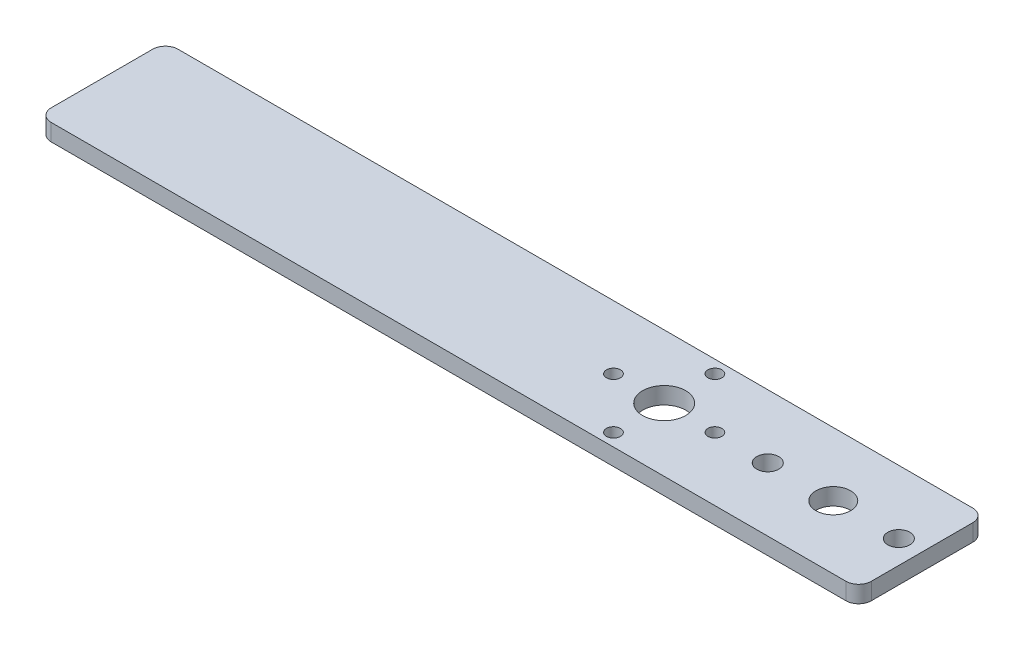
ISO-10303-21;
HEADER;
FILE_DESCRIPTION(('STEP AP214'),'2;1');
FILE_NAME('part.step','',(''),(''),'','','');
FILE_SCHEMA(('AUTOMOTIVE_DESIGN { 1 0 10303 214 1 1 1 1 }'));
ENDSEC;
DATA;
#1=APPLICATION_CONTEXT('core data for automotive mechanical design processes');
#2=APPLICATION_PROTOCOL_DEFINITION('international standard','automotive_design',2000,#1);
#3=PRODUCT_CONTEXT('',#1,'mechanical');
#4=PRODUCT('Part','Part','',(#3));
#5=PRODUCT_RELATED_PRODUCT_CATEGORY('part','',(#4));
#6=PRODUCT_DEFINITION_FORMATION('','',#4);
#7=PRODUCT_DEFINITION_CONTEXT('part definition',#1,'design');
#8=PRODUCT_DEFINITION('design','',#6,#7);
#9=PRODUCT_DEFINITION_SHAPE('','',#8);
#10=(LENGTH_UNIT() NAMED_UNIT(*) SI_UNIT(.MILLI.,.METRE.));
#11=(NAMED_UNIT(*) PLANE_ANGLE_UNIT() SI_UNIT($,.RADIAN.));
#12=(NAMED_UNIT(*) SI_UNIT($,.STERADIAN.) SOLID_ANGLE_UNIT());
#13=UNCERTAINTY_MEASURE_WITH_UNIT(LENGTH_MEASURE(1.E-05),#10,'distance_accuracy_value','');
#14=(GEOMETRIC_REPRESENTATION_CONTEXT(3) GLOBAL_UNCERTAINTY_ASSIGNED_CONTEXT((#13)) GLOBAL_UNIT_ASSIGNED_CONTEXT((#10,
#11,#12)) REPRESENTATION_CONTEXT('',''));
#15=CARTESIAN_POINT('',(0.,0.,0.));
#16=DIRECTION('',(0.,0.,1.));
#17=DIRECTION('',(1.,0.,0.));
#18=AXIS2_PLACEMENT_3D('',#15,#16,#17);
#19=CARTESIAN_POINT('',(146.,4.,12.));
#20=DIRECTION('',(0.,-1.,0.));
#21=DIRECTION('',(0.,0.,-1.));
#22=AXIS2_PLACEMENT_3D('',#19,#20,#21);
#23=PLANE('',#22);
#24=CARTESIAN_POINT('',(146.,4.,12.));
#25=DIRECTION('',(0.,1.,0.));
#26=DIRECTION('',(0.,0.,-1.));
#27=AXIS2_PLACEMENT_3D('',#24,#25,#26);
#28=CIRCLE('',#27,3.00000000000001);
#29=CARTESIAN_POINT('',(146.,4.,15.));
#30=VERTEX_POINT('',#29);
#31=CARTESIAN_POINT('',(149.,4.,12.));
#32=VERTEX_POINT('',#31);
#33=EDGE_CURVE('E148',#30,#32,#28,.T.);
#34=ORIENTED_EDGE('',*,*,#33,.T.);
#35=DIRECTION('',(0.,0.,-1.));
#36=VECTOR('',#35,1.);
#37=CARTESIAN_POINT('',(149.,4.,-12.));
#38=LINE('',#37,#36);
#39=CARTESIAN_POINT('',(149.,4.,-12.));
#40=VERTEX_POINT('',#39);
#41=EDGE_CURVE('E96',#32,#40,#38,.T.);
#42=ORIENTED_EDGE('',*,*,#41,.T.);
#43=CARTESIAN_POINT('',(146.,4.,-12.));
#44=DIRECTION('',(0.,1.,0.));
#45=DIRECTION('',(0.,0.,1.));
#46=AXIS2_PLACEMENT_3D('',#43,#44,#45);
#47=CIRCLE('',#46,3.00000000000001);
#48=CARTESIAN_POINT('',(146.,4.,-15.));
#49=VERTEX_POINT('',#48);
#50=EDGE_CURVE('E163',#40,#49,#47,.T.);
#51=ORIENTED_EDGE('',*,*,#50,.T.);
#52=DIRECTION('',(-1.,0.,0.));
#53=VECTOR('',#52,1.);
#54=CARTESIAN_POINT('',(-42.,4.,-15.));
#55=LINE('',#54,#53);
#56=CARTESIAN_POINT('',(-42.,4.,-15.));
#57=VERTEX_POINT('',#56);
#58=EDGE_CURVE('E176',#49,#57,#55,.T.);
#59=ORIENTED_EDGE('',*,*,#58,.T.);
#60=CARTESIAN_POINT('',(-42.,4.,-12.));
#61=DIRECTION('',(0.,1.,0.));
#62=DIRECTION('',(0.,0.,-1.));
#63=AXIS2_PLACEMENT_3D('',#60,#61,#62);
#64=CIRCLE('',#63,3.00000000000001);
#65=CARTESIAN_POINT('',(-45.,4.,-12.));
#66=VERTEX_POINT('',#65);
#67=EDGE_CURVE('E115',#57,#66,#64,.T.);
#68=ORIENTED_EDGE('',*,*,#67,.T.);
#69=DIRECTION('',(0.,0.,1.));
#70=VECTOR('',#69,1.);
#71=CARTESIAN_POINT('',(-45.,4.,-12.));
#72=LINE('',#71,#70);
#73=CARTESIAN_POINT('',(-45.,4.,12.));
#74=VERTEX_POINT('',#73);
#75=EDGE_CURVE('E109',#66,#74,#72,.T.);
#76=ORIENTED_EDGE('',*,*,#75,.T.);
#77=CARTESIAN_POINT('',(-42.,4.,12.));
#78=DIRECTION('',(0.,1.,0.));
#79=DIRECTION('',(0.,0.,-1.));
#80=AXIS2_PLACEMENT_3D('',#77,#78,#79);
#81=CIRCLE('',#80,3.);
#82=CARTESIAN_POINT('',(-42.,4.,15.));
#83=VERTEX_POINT('',#82);
#84=EDGE_CURVE('E113',#74,#83,#81,.T.);
#85=ORIENTED_EDGE('',*,*,#84,.T.);
#86=DIRECTION('',(1.,0.,0.));
#87=VECTOR('',#86,1.);
#88=CARTESIAN_POINT('',(-42.,4.,15.));
#89=LINE('',#88,#87);
#90=EDGE_CURVE('E53',#83,#30,#89,.T.);
#91=ORIENTED_EDGE('',*,*,#90,.T.);
#92=EDGE_LOOP('',(#34,#42,#51,#59,#68,#76,#85,#91));
#93=FACE_BOUND('',#92,.T.);
#94=CARTESIAN_POINT('',(88.,4.,0.));
#95=DIRECTION('',(0.,1.,0.));
#96=DIRECTION('',(0.,0.,1.));
#97=AXIS2_PLACEMENT_3D('',#94,#95,#96);
#98=CIRCLE('',#97,5.10000000000001);
#99=CARTESIAN_POINT('',(88.,4.,5.10000000000002));
#100=VERTEX_POINT('',#99);
#101=EDGE_CURVE('E137',#100,#100,#98,.T.);
#102=ORIENTED_EDGE('',*,*,#101,.F.);
#103=EDGE_LOOP('',(#102));
#104=FACE_BOUND('',#103,.T.);
#105=CARTESIAN_POINT('',(88.,4.,-12.));
#106=DIRECTION('',(0.,1.,0.));
#107=DIRECTION('',(0.,0.,1.));
#108=AXIS2_PLACEMENT_3D('',#105,#106,#107);
#109=CIRCLE('',#108,1.65);
#110=CARTESIAN_POINT('',(88.,4.,-10.35));
#111=VERTEX_POINT('',#110);
#112=EDGE_CURVE('E185',#111,#111,#109,.T.);
#113=ORIENTED_EDGE('',*,*,#112,.F.);
#114=EDGE_LOOP('',(#113));
#115=FACE_BOUND('',#114,.T.);
#116=CARTESIAN_POINT('',(88.,4.,12.));
#117=DIRECTION('',(0.,1.,0.));
#118=DIRECTION('',(0.,0.,1.));
#119=AXIS2_PLACEMENT_3D('',#116,#117,#118);
#120=CIRCLE('',#119,1.65);
#121=CARTESIAN_POINT('',(88.,4.,13.65));
#122=VERTEX_POINT('',#121);
#123=EDGE_CURVE('E191',#122,#122,#120,.T.);
#124=ORIENTED_EDGE('',*,*,#123,.F.);
#125=EDGE_LOOP('',(#124));
#126=FACE_BOUND('',#125,.T.);
#127=CARTESIAN_POINT('',(100.,4.,0.));
#128=DIRECTION('',(0.,1.,0.));
#129=DIRECTION('',(0.,0.,-1.));
#130=AXIS2_PLACEMENT_3D('',#127,#128,#129);
#131=CIRCLE('',#130,1.65);
#132=CARTESIAN_POINT('',(100.,4.,-1.64999999999999));
#133=VERTEX_POINT('',#132);
#134=EDGE_CURVE('E197',#133,#133,#131,.T.);
#135=ORIENTED_EDGE('',*,*,#134,.F.);
#136=EDGE_LOOP('',(#135));
#137=FACE_BOUND('',#136,.T.);
#138=CARTESIAN_POINT('',(76.,4.,0.));
#139=DIRECTION('',(0.,1.,0.));
#140=DIRECTION('',(0.,0.,1.));
#141=AXIS2_PLACEMENT_3D('',#138,#139,#140);
#142=CIRCLE('',#141,1.65);
#143=CARTESIAN_POINT('',(76.,4.,1.65000000000002));
#144=VERTEX_POINT('',#143);
#145=EDGE_CURVE('E203',#144,#144,#142,.T.);
#146=ORIENTED_EDGE('',*,*,#145,.F.);
#147=EDGE_LOOP('',(#146));
#148=FACE_BOUND('',#147,.T.);
#149=CARTESIAN_POINT('',(143.5,4.,0.));
#150=DIRECTION('',(0.,1.,0.));
#151=DIRECTION('',(0.,0.,1.));
#152=AXIS2_PLACEMENT_3D('',#149,#150,#151);
#153=CIRCLE('',#152,2.59999999999999);
#154=CARTESIAN_POINT('',(143.5,4.,2.59999999999999));
#155=VERTEX_POINT('',#154);
#156=EDGE_CURVE('E209',#155,#155,#153,.T.);
#157=ORIENTED_EDGE('',*,*,#156,.F.);
#158=EDGE_LOOP('',(#157));
#159=FACE_BOUND('',#158,.T.);
#160=CARTESIAN_POINT('',(112.5,4.,0.));
#161=DIRECTION('',(0.,1.,0.));
#162=DIRECTION('',(0.,0.,1.));
#163=AXIS2_PLACEMENT_3D('',#160,#161,#162);
#164=CIRCLE('',#163,2.6);
#165=CARTESIAN_POINT('',(112.5,4.,2.6));
#166=VERTEX_POINT('',#165);
#167=EDGE_CURVE('E215',#166,#166,#164,.T.);
#168=ORIENTED_EDGE('',*,*,#167,.F.);
#169=EDGE_LOOP('',(#168));
#170=FACE_BOUND('',#169,.T.);
#171=CARTESIAN_POINT('',(128.,4.,0.));
#172=DIRECTION('',(0.,1.,0.));
#173=DIRECTION('',(0.,0.,1.));
#174=AXIS2_PLACEMENT_3D('',#171,#172,#173);
#175=CIRCLE('',#174,4.09999999999999);
#176=CARTESIAN_POINT('',(128.,4.,4.09999999999999));
#177=VERTEX_POINT('',#176);
#178=EDGE_CURVE('E221',#177,#177,#175,.T.);
#179=ORIENTED_EDGE('',*,*,#178,.F.);
#180=EDGE_LOOP('',(#179));
#181=FACE_BOUND('',#180,.T.);
#182=ADVANCED_FACE('F36',(#93,#104,#115,#126,#137,#148,#159,#170,#181),#23,.F.);
#183=CARTESIAN_POINT('',(146.,0.,12.));
#184=DIRECTION('',(0.,-1.,0.));
#185=DIRECTION('',(0.,0.,-1.));
#186=AXIS2_PLACEMENT_3D('',#183,#184,#185);
#187=PLANE('',#186);
#188=CARTESIAN_POINT('',(112.5,0.,0.));
#189=DIRECTION('',(0.,1.,0.));
#190=DIRECTION('',(0.,0.,1.));
#191=AXIS2_PLACEMENT_3D('',#188,#189,#190);
#192=CIRCLE('',#191,2.6);
#193=CARTESIAN_POINT('',(112.5,0.,2.6));
#194=VERTEX_POINT('',#193);
#195=EDGE_CURVE('E218',#194,#194,#192,.T.);
#196=ORIENTED_EDGE('',*,*,#195,.T.);
#197=EDGE_LOOP('',(#196));
#198=FACE_BOUND('',#197,.T.);
#199=CARTESIAN_POINT('',(76.,0.,0.));
#200=DIRECTION('',(0.,1.,0.));
#201=DIRECTION('',(0.,0.,1.));
#202=AXIS2_PLACEMENT_3D('',#199,#200,#201);
#203=CIRCLE('',#202,1.65);
#204=CARTESIAN_POINT('',(76.,0.,1.65000000000002));
#205=VERTEX_POINT('',#204);
#206=EDGE_CURVE('E206',#205,#205,#203,.T.);
#207=ORIENTED_EDGE('',*,*,#206,.T.);
#208=EDGE_LOOP('',(#207));
#209=FACE_BOUND('',#208,.T.);
#210=CARTESIAN_POINT('',(88.,0.,12.));
#211=DIRECTION('',(0.,1.,0.));
#212=DIRECTION('',(0.,0.,1.));
#213=AXIS2_PLACEMENT_3D('',#210,#211,#212);
#214=CIRCLE('',#213,1.65);
#215=CARTESIAN_POINT('',(88.,0.,13.65));
#216=VERTEX_POINT('',#215);
#217=EDGE_CURVE('E194',#216,#216,#214,.T.);
#218=ORIENTED_EDGE('',*,*,#217,.T.);
#219=EDGE_LOOP('',(#218));
#220=FACE_BOUND('',#219,.T.);
#221=CARTESIAN_POINT('',(88.,0.,0.));
#222=DIRECTION('',(0.,1.,0.));
#223=DIRECTION('',(0.,0.,1.));
#224=AXIS2_PLACEMENT_3D('',#221,#222,#223);
#225=CIRCLE('',#224,5.10000000000001);
#226=CARTESIAN_POINT('',(88.,0.,5.10000000000002));
#227=VERTEX_POINT('',#226);
#228=EDGE_CURVE('E182',#227,#227,#225,.T.);
#229=ORIENTED_EDGE('',*,*,#228,.T.);
#230=EDGE_LOOP('',(#229));
#231=FACE_BOUND('',#230,.T.);
#232=CARTESIAN_POINT('',(146.,0.,12.));
#233=DIRECTION('',(0.,1.,0.));
#234=DIRECTION('',(0.,0.,-1.));
#235=AXIS2_PLACEMENT_3D('',#232,#233,#234);
#236=CIRCLE('',#235,3.00000000000001);
#237=CARTESIAN_POINT('',(146.,0.,15.));
#238=VERTEX_POINT('',#237);
#239=CARTESIAN_POINT('',(149.,0.,12.));
#240=VERTEX_POINT('',#239);
#241=EDGE_CURVE('E133',#238,#240,#236,.T.);
#242=ORIENTED_EDGE('',*,*,#241,.F.);
#243=DIRECTION('',(1.,0.,0.));
#244=VECTOR('',#243,1.);
#245=CARTESIAN_POINT('',(-42.,0.,15.));
#246=LINE('',#245,#244);
#247=CARTESIAN_POINT('',(-42.,0.,15.));
#248=VERTEX_POINT('',#247);
#249=EDGE_CURVE('E88',#248,#238,#246,.T.);
#250=ORIENTED_EDGE('',*,*,#249,.F.);
#251=CARTESIAN_POINT('',(-42.,0.,12.));
#252=DIRECTION('',(0.,1.,0.));
#253=DIRECTION('',(0.,0.,-1.));
#254=AXIS2_PLACEMENT_3D('',#251,#252,#253);
#255=CIRCLE('',#254,3.);
#256=CARTESIAN_POINT('',(-45.,0.,12.));
#257=VERTEX_POINT('',#256);
#258=EDGE_CURVE('E82',#257,#248,#255,.T.);
#259=ORIENTED_EDGE('',*,*,#258,.F.);
#260=DIRECTION('',(0.,0.,1.));
#261=VECTOR('',#260,1.);
#262=CARTESIAN_POINT('',(-45.,0.,-12.));
#263=LINE('',#262,#261);
#264=CARTESIAN_POINT('',(-45.,0.,-12.));
#265=VERTEX_POINT('',#264);
#266=EDGE_CURVE('E123',#265,#257,#263,.T.);
#267=ORIENTED_EDGE('',*,*,#266,.F.);
#268=CARTESIAN_POINT('',(-42.,0.,-12.));
#269=DIRECTION('',(0.,1.,0.));
#270=DIRECTION('',(0.,0.,-1.));
#271=AXIS2_PLACEMENT_3D('',#268,#269,#270);
#272=CIRCLE('',#271,3.00000000000001);
#273=CARTESIAN_POINT('',(-42.,0.,-15.));
#274=VERTEX_POINT('',#273);
#275=EDGE_CURVE('E143',#274,#265,#272,.T.);
#276=ORIENTED_EDGE('',*,*,#275,.F.);
#277=DIRECTION('',(-1.,0.,0.));
#278=VECTOR('',#277,1.);
#279=CARTESIAN_POINT('',(-42.,0.,-15.));
#280=LINE('',#279,#278);
#281=CARTESIAN_POINT('',(146.,0.,-15.));
#282=VERTEX_POINT('',#281);
#283=EDGE_CURVE('E141',#282,#274,#280,.T.);
#284=ORIENTED_EDGE('',*,*,#283,.F.);
#285=CARTESIAN_POINT('',(146.,0.,-12.));
#286=DIRECTION('',(0.,1.,0.));
#287=DIRECTION('',(0.,0.,1.));
#288=AXIS2_PLACEMENT_3D('',#285,#286,#287);
#289=CIRCLE('',#288,3.00000000000001);
#290=CARTESIAN_POINT('',(149.,0.,-12.));
#291=VERTEX_POINT('',#290);
#292=EDGE_CURVE('E139',#291,#282,#289,.T.);
#293=ORIENTED_EDGE('',*,*,#292,.F.);
#294=DIRECTION('',(0.,0.,-1.));
#295=VECTOR('',#294,1.);
#296=CARTESIAN_POINT('',(149.,0.,-12.));
#297=LINE('',#296,#295);
#298=EDGE_CURVE('E136',#240,#291,#297,.T.);
#299=ORIENTED_EDGE('',*,*,#298,.F.);
#300=EDGE_LOOP('',(#242,#250,#259,#267,#276,#284,#293,#299));
#301=FACE_BOUND('',#300,.T.);
#302=CARTESIAN_POINT('',(88.,0.,-12.));
#303=DIRECTION('',(0.,1.,0.));
#304=DIRECTION('',(0.,0.,1.));
#305=AXIS2_PLACEMENT_3D('',#302,#303,#304);
#306=CIRCLE('',#305,1.65);
#307=CARTESIAN_POINT('',(88.,0.,-10.35));
#308=VERTEX_POINT('',#307);
#309=EDGE_CURVE('E188',#308,#308,#306,.T.);
#310=ORIENTED_EDGE('',*,*,#309,.T.);
#311=EDGE_LOOP('',(#310));
#312=FACE_BOUND('',#311,.T.);
#313=CARTESIAN_POINT('',(100.,0.,0.));
#314=DIRECTION('',(0.,1.,0.));
#315=DIRECTION('',(0.,0.,-1.));
#316=AXIS2_PLACEMENT_3D('',#313,#314,#315);
#317=CIRCLE('',#316,1.65);
#318=CARTESIAN_POINT('',(100.,0.,-1.64999999999999));
#319=VERTEX_POINT('',#318);
#320=EDGE_CURVE('E200',#319,#319,#317,.T.);
#321=ORIENTED_EDGE('',*,*,#320,.T.);
#322=EDGE_LOOP('',(#321));
#323=FACE_BOUND('',#322,.T.);
#324=CARTESIAN_POINT('',(143.5,0.,0.));
#325=DIRECTION('',(0.,1.,0.));
#326=DIRECTION('',(0.,0.,1.));
#327=AXIS2_PLACEMENT_3D('',#324,#325,#326);
#328=CIRCLE('',#327,2.59999999999999);
#329=CARTESIAN_POINT('',(143.5,0.,2.59999999999999));
#330=VERTEX_POINT('',#329);
#331=EDGE_CURVE('E212',#330,#330,#328,.T.);
#332=ORIENTED_EDGE('',*,*,#331,.T.);
#333=EDGE_LOOP('',(#332));
#334=FACE_BOUND('',#333,.T.);
#335=CARTESIAN_POINT('',(128.,0.,0.));
#336=DIRECTION('',(0.,1.,0.));
#337=DIRECTION('',(0.,0.,1.));
#338=AXIS2_PLACEMENT_3D('',#335,#336,#337);
#339=CIRCLE('',#338,4.09999999999999);
#340=CARTESIAN_POINT('',(128.,0.,4.09999999999999));
#341=VERTEX_POINT('',#340);
#342=EDGE_CURVE('E224',#341,#341,#339,.T.);
#343=ORIENTED_EDGE('',*,*,#342,.T.);
#344=EDGE_LOOP('',(#343));
#345=FACE_BOUND('',#344,.T.);
#346=ADVANCED_FACE('F167',(#198,#209,#220,#231,#301,#312,#323,#334,#345),#187,.T.);
#347=CARTESIAN_POINT('',(146.,4.,12.));
#348=DIRECTION('',(0.,-1.,0.));
#349=DIRECTION('',(0.,0.,-1.));
#350=AXIS2_PLACEMENT_3D('',#347,#348,#349);
#351=CYLINDRICAL_SURFACE('',#350,3.00000000000001);
#352=ORIENTED_EDGE('',*,*,#241,.T.);
#353=DIRECTION('',(0.,-1.,0.));
#354=VECTOR('',#353,1.);
#355=CARTESIAN_POINT('',(149.,4.,12.));
#356=LINE('',#355,#354);
#357=EDGE_CURVE('E11',#32,#240,#356,.T.);
#358=ORIENTED_EDGE('',*,*,#357,.F.);
#359=ORIENTED_EDGE('',*,*,#33,.F.);
#360=DIRECTION('',(0.,-1.,0.));
#361=VECTOR('',#360,1.);
#362=CARTESIAN_POINT('',(146.,4.,15.));
#363=LINE('',#362,#361);
#364=EDGE_CURVE('E129',#30,#238,#363,.T.);
#365=ORIENTED_EDGE('',*,*,#364,.T.);
#366=EDGE_LOOP('',(#352,#358,#359,#365));
#367=FACE_BOUND('',#366,.T.);
#368=ADVANCED_FACE('F38',(#367),#351,.T.);
#369=CARTESIAN_POINT('',(149.,4.,-12.));
#370=DIRECTION('',(-1.,0.,0.));
#371=DIRECTION('',(0.,0.,1.));
#372=AXIS2_PLACEMENT_3D('',#369,#370,#371);
#373=PLANE('',#372);
#374=ORIENTED_EDGE('',*,*,#298,.T.);
#375=DIRECTION('',(0.,-1.,0.));
#376=VECTOR('',#375,1.);
#377=CARTESIAN_POINT('',(149.,4.,-12.));
#378=LINE('',#377,#376);
#379=EDGE_CURVE('E45',#40,#291,#378,.T.);
#380=ORIENTED_EDGE('',*,*,#379,.F.);
#381=ORIENTED_EDGE('',*,*,#41,.F.);
#382=ORIENTED_EDGE('',*,*,#357,.T.);
#383=EDGE_LOOP('',(#374,#380,#381,#382));
#384=FACE_BOUND('',#383,.T.);
#385=ADVANCED_FACE('F256',(#384),#373,.F.);
#386=CARTESIAN_POINT('',(146.,4.,-12.));
#387=DIRECTION('',(0.,-1.,0.));
#388=DIRECTION('',(0.,0.,-1.));
#389=AXIS2_PLACEMENT_3D('',#386,#387,#388);
#390=CYLINDRICAL_SURFACE('',#389,3.00000000000001);
#391=ORIENTED_EDGE('',*,*,#292,.T.);
#392=DIRECTION('',(0.,-1.,0.));
#393=VECTOR('',#392,1.);
#394=CARTESIAN_POINT('',(146.,4.,-15.));
#395=LINE('',#394,#393);
#396=EDGE_CURVE('E155',#49,#282,#395,.T.);
#397=ORIENTED_EDGE('',*,*,#396,.F.);
#398=ORIENTED_EDGE('',*,*,#50,.F.);
#399=ORIENTED_EDGE('',*,*,#379,.T.);
#400=EDGE_LOOP('',(#391,#397,#398,#399));
#401=FACE_BOUND('',#400,.T.);
#402=ADVANCED_FACE('F161',(#401),#390,.T.);
#403=CARTESIAN_POINT('',(-42.,4.,-15.));
#404=DIRECTION('',(0.,0.,1.));
#405=DIRECTION('',(1.,0.,0.));
#406=AXIS2_PLACEMENT_3D('',#403,#404,#405);
#407=PLANE('',#406);
#408=ORIENTED_EDGE('',*,*,#283,.T.);
#409=DIRECTION('',(0.,-1.,0.));
#410=VECTOR('',#409,1.);
#411=CARTESIAN_POINT('',(-42.,4.,-15.));
#412=LINE('',#411,#410);
#413=EDGE_CURVE('E152',#57,#274,#412,.T.);
#414=ORIENTED_EDGE('',*,*,#413,.F.);
#415=ORIENTED_EDGE('',*,*,#58,.F.);
#416=ORIENTED_EDGE('',*,*,#396,.T.);
#417=EDGE_LOOP('',(#408,#414,#415,#416));
#418=FACE_BOUND('',#417,.T.);
#419=ADVANCED_FACE('F172',(#418),#407,.F.);
#420=CARTESIAN_POINT('',(-42.,4.,-12.));
#421=DIRECTION('',(0.,-1.,0.));
#422=DIRECTION('',(0.,0.,-1.));
#423=AXIS2_PLACEMENT_3D('',#420,#421,#422);
#424=CYLINDRICAL_SURFACE('',#423,3.00000000000001);
#425=ORIENTED_EDGE('',*,*,#275,.T.);
#426=DIRECTION('',(0.,-1.,0.));
#427=VECTOR('',#426,1.);
#428=CARTESIAN_POINT('',(-45.,4.,-12.));
#429=LINE('',#428,#427);
#430=EDGE_CURVE('E124',#66,#265,#429,.T.);
#431=ORIENTED_EDGE('',*,*,#430,.F.);
#432=ORIENTED_EDGE('',*,*,#67,.F.);
#433=ORIENTED_EDGE('',*,*,#413,.T.);
#434=EDGE_LOOP('',(#425,#431,#432,#433));
#435=FACE_BOUND('',#434,.T.);
#436=ADVANCED_FACE('F175',(#435),#424,.T.);
#437=CARTESIAN_POINT('',(-45.,4.,-12.));
#438=DIRECTION('',(1.,0.,0.));
#439=DIRECTION('',(0.,0.,-1.));
#440=AXIS2_PLACEMENT_3D('',#437,#438,#439);
#441=PLANE('',#440);
#442=ORIENTED_EDGE('',*,*,#266,.T.);
#443=DIRECTION('',(0.,-1.,0.));
#444=VECTOR('',#443,1.);
#445=CARTESIAN_POINT('',(-45.,4.,12.));
#446=LINE('',#445,#444);
#447=EDGE_CURVE('E120',#74,#257,#446,.T.);
#448=ORIENTED_EDGE('',*,*,#447,.F.);
#449=ORIENTED_EDGE('',*,*,#75,.F.);
#450=ORIENTED_EDGE('',*,*,#430,.T.);
#451=EDGE_LOOP('',(#442,#448,#449,#450));
#452=FACE_BOUND('',#451,.T.);
#453=ADVANCED_FACE('F121',(#452),#441,.F.);
#454=CARTESIAN_POINT('',(-42.,4.,12.));
#455=DIRECTION('',(0.,-1.,0.));
#456=DIRECTION('',(0.,0.,-1.));
#457=AXIS2_PLACEMENT_3D('',#454,#455,#456);
#458=CYLINDRICAL_SURFACE('',#457,3.);
#459=ORIENTED_EDGE('',*,*,#258,.T.);
#460=DIRECTION('',(0.,-1.,0.));
#461=VECTOR('',#460,1.);
#462=CARTESIAN_POINT('',(-42.,4.,15.));
#463=LINE('',#462,#461);
#464=EDGE_CURVE('E125',#83,#248,#463,.T.);
#465=ORIENTED_EDGE('',*,*,#464,.F.);
#466=ORIENTED_EDGE('',*,*,#84,.F.);
#467=ORIENTED_EDGE('',*,*,#447,.T.);
#468=EDGE_LOOP('',(#459,#465,#466,#467));
#469=FACE_BOUND('',#468,.T.);
#470=ADVANCED_FACE('F127',(#469),#458,.T.);
#471=CARTESIAN_POINT('',(-42.,4.,15.));
#472=DIRECTION('',(0.,0.,-1.));
#473=DIRECTION('',(-1.,0.,0.));
#474=AXIS2_PLACEMENT_3D('',#471,#472,#473);
#475=PLANE('',#474);
#476=ORIENTED_EDGE('',*,*,#249,.T.);
#477=ORIENTED_EDGE('',*,*,#364,.F.);
#478=ORIENTED_EDGE('',*,*,#90,.F.);
#479=ORIENTED_EDGE('',*,*,#464,.T.);
#480=EDGE_LOOP('',(#476,#477,#478,#479));
#481=FACE_BOUND('',#480,.T.);
#482=ADVANCED_FACE('F244',(#481),#475,.F.);
#483=CARTESIAN_POINT('',(88.,4.,0.));
#484=DIRECTION('',(0.,-1.,0.));
#485=DIRECTION('',(0.,0.,-1.));
#486=AXIS2_PLACEMENT_3D('',#483,#484,#485);
#487=CYLINDRICAL_SURFACE('',#486,5.10000000000001);
#488=ORIENTED_EDGE('',*,*,#101,.T.);
#489=EDGE_LOOP('',(#488));
#490=FACE_BOUND('',#489,.T.);
#491=ORIENTED_EDGE('',*,*,#228,.F.);
#492=EDGE_LOOP('',(#491));
#493=FACE_BOUND('',#492,.T.);
#494=ADVANCED_FACE('F241',(#490,#493),#487,.F.);
#495=CARTESIAN_POINT('',(88.,4.,-12.));
#496=DIRECTION('',(0.,-1.,0.));
#497=DIRECTION('',(0.,0.,-1.));
#498=AXIS2_PLACEMENT_3D('',#495,#496,#497);
#499=CYLINDRICAL_SURFACE('',#498,1.65);
#500=ORIENTED_EDGE('',*,*,#112,.T.);
#501=EDGE_LOOP('',(#500));
#502=FACE_BOUND('',#501,.T.);
#503=ORIENTED_EDGE('',*,*,#309,.F.);
#504=EDGE_LOOP('',(#503));
#505=FACE_BOUND('',#504,.T.);
#506=ADVANCED_FACE('F320',(#502,#505),#499,.F.);
#507=CARTESIAN_POINT('',(88.,4.,12.));
#508=DIRECTION('',(0.,-1.,0.));
#509=DIRECTION('',(0.,0.,-1.));
#510=AXIS2_PLACEMENT_3D('',#507,#508,#509);
#511=CYLINDRICAL_SURFACE('',#510,1.65);
#512=ORIENTED_EDGE('',*,*,#123,.T.);
#513=EDGE_LOOP('',(#512));
#514=FACE_BOUND('',#513,.T.);
#515=ORIENTED_EDGE('',*,*,#217,.F.);
#516=EDGE_LOOP('',(#515));
#517=FACE_BOUND('',#516,.T.);
#518=ADVANCED_FACE('F328',(#514,#517),#511,.F.);
#519=CARTESIAN_POINT('',(100.,4.,0.));
#520=DIRECTION('',(0.,-1.,0.));
#521=DIRECTION('',(0.,0.,-1.));
#522=AXIS2_PLACEMENT_3D('',#519,#520,#521);
#523=CYLINDRICAL_SURFACE('',#522,1.65);
#524=ORIENTED_EDGE('',*,*,#134,.T.);
#525=EDGE_LOOP('',(#524));
#526=FACE_BOUND('',#525,.T.);
#527=ORIENTED_EDGE('',*,*,#320,.F.);
#528=EDGE_LOOP('',(#527));
#529=FACE_BOUND('',#528,.T.);
#530=ADVANCED_FACE('F336',(#526,#529),#523,.F.);
#531=CARTESIAN_POINT('',(76.,4.,0.));
#532=DIRECTION('',(0.,-1.,0.));
#533=DIRECTION('',(0.,0.,-1.));
#534=AXIS2_PLACEMENT_3D('',#531,#532,#533);
#535=CYLINDRICAL_SURFACE('',#534,1.65);
#536=ORIENTED_EDGE('',*,*,#145,.T.);
#537=EDGE_LOOP('',(#536));
#538=FACE_BOUND('',#537,.T.);
#539=ORIENTED_EDGE('',*,*,#206,.F.);
#540=EDGE_LOOP('',(#539));
#541=FACE_BOUND('',#540,.T.);
#542=ADVANCED_FACE('F345',(#538,#541),#535,.F.);
#543=CARTESIAN_POINT('',(143.5,4.,0.));
#544=DIRECTION('',(0.,-1.,0.));
#545=DIRECTION('',(0.,0.,-1.));
#546=AXIS2_PLACEMENT_3D('',#543,#544,#545);
#547=CYLINDRICAL_SURFACE('',#546,2.59999999999999);
#548=ORIENTED_EDGE('',*,*,#156,.T.);
#549=EDGE_LOOP('',(#548));
#550=FACE_BOUND('',#549,.T.);
#551=ORIENTED_EDGE('',*,*,#331,.F.);
#552=EDGE_LOOP('',(#551));
#553=FACE_BOUND('',#552,.T.);
#554=ADVANCED_FACE('F354',(#550,#553),#547,.F.);
#555=CARTESIAN_POINT('',(112.5,4.,0.));
#556=DIRECTION('',(0.,-1.,0.));
#557=DIRECTION('',(0.,0.,-1.));
#558=AXIS2_PLACEMENT_3D('',#555,#556,#557);
#559=CYLINDRICAL_SURFACE('',#558,2.6);
#560=ORIENTED_EDGE('',*,*,#167,.T.);
#561=EDGE_LOOP('',(#560));
#562=FACE_BOUND('',#561,.T.);
#563=ORIENTED_EDGE('',*,*,#195,.F.);
#564=EDGE_LOOP('',(#563));
#565=FACE_BOUND('',#564,.T.);
#566=ADVANCED_FACE('F363',(#562,#565),#559,.F.);
#567=CARTESIAN_POINT('',(128.,4.,0.));
#568=DIRECTION('',(0.,-1.,0.));
#569=DIRECTION('',(0.,0.,-1.));
#570=AXIS2_PLACEMENT_3D('',#567,#568,#569);
#571=CYLINDRICAL_SURFACE('',#570,4.09999999999999);
#572=ORIENTED_EDGE('',*,*,#178,.T.);
#573=EDGE_LOOP('',(#572));
#574=FACE_BOUND('',#573,.T.);
#575=ORIENTED_EDGE('',*,*,#342,.F.);
#576=EDGE_LOOP('',(#575));
#577=FACE_BOUND('',#576,.T.);
#578=ADVANCED_FACE('F230',(#574,#577),#571,.F.);
#579=CLOSED_SHELL('',(#182,#346,#368,#385,#402,#419,#436,#453,#470,#482,#494,#506,#518,#530,
#542,#554,#566,#578));
#580=MANIFOLD_SOLID_BREP('B2',#579);
#581=ADVANCED_BREP_SHAPE_REPRESENTATION('',(#18,#580),#14);
#582=SHAPE_DEFINITION_REPRESENTATION(#9,#581);
ENDSEC;
END-ISO-10303-21;
